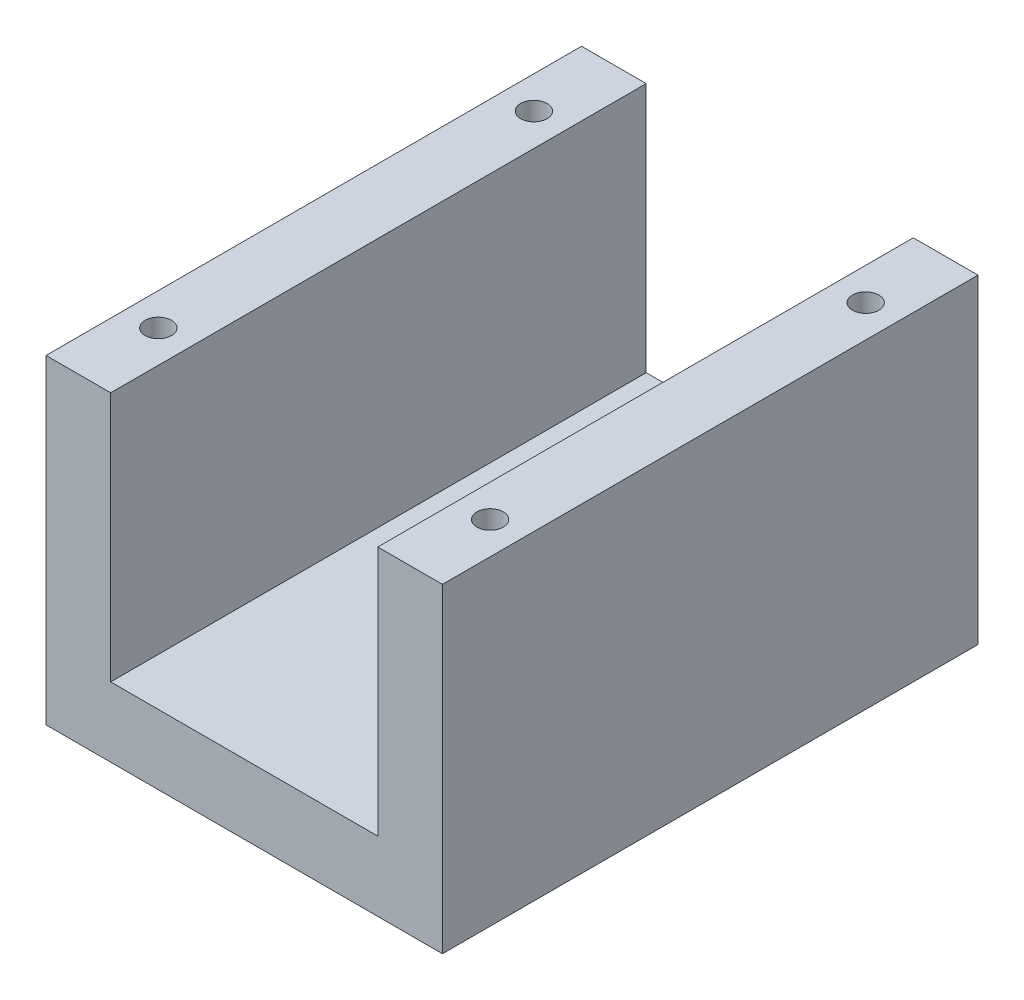
ISO-10303-21;
HEADER;
FILE_DESCRIPTION(('STEP AP214'),'2;1');
FILE_NAME('part.step','',(''),(''),'','','');
FILE_SCHEMA(('AUTOMOTIVE_DESIGN { 1 0 10303 214 1 1 1 1 }'));
ENDSEC;
DATA;
#1=APPLICATION_CONTEXT('core data for automotive mechanical design processes');
#2=APPLICATION_PROTOCOL_DEFINITION('international standard','automotive_design',2000,#1);
#3=PRODUCT_CONTEXT('',#1,'mechanical');
#4=PRODUCT('Part','Part','',(#3));
#5=PRODUCT_RELATED_PRODUCT_CATEGORY('part','',(#4));
#6=PRODUCT_DEFINITION_FORMATION('','',#4);
#7=PRODUCT_DEFINITION_CONTEXT('part definition',#1,'design');
#8=PRODUCT_DEFINITION('design','',#6,#7);
#9=PRODUCT_DEFINITION_SHAPE('','',#8);
#10=(LENGTH_UNIT() NAMED_UNIT(*) SI_UNIT(.MILLI.,.METRE.));
#11=(NAMED_UNIT(*) PLANE_ANGLE_UNIT() SI_UNIT($,.RADIAN.));
#12=(NAMED_UNIT(*) SI_UNIT($,.STERADIAN.) SOLID_ANGLE_UNIT());
#13=UNCERTAINTY_MEASURE_WITH_UNIT(LENGTH_MEASURE(1.E-05),#10,'distance_accuracy_value','');
#14=(GEOMETRIC_REPRESENTATION_CONTEXT(3) GLOBAL_UNCERTAINTY_ASSIGNED_CONTEXT((#13)) GLOBAL_UNIT_ASSIGNED_CONTEXT((#10,
#11,#12)) REPRESENTATION_CONTEXT('',''));
#15=CARTESIAN_POINT('',(0.,0.,0.));
#16=DIRECTION('',(0.,0.,1.));
#17=DIRECTION('',(1.,0.,0.));
#18=AXIS2_PLACEMENT_3D('',#15,#16,#17);
#19=CARTESIAN_POINT('',(28.5,44.,-18.5));
#20=DIRECTION('',(-1.,0.,0.));
#21=DIRECTION('',(0.,0.,1.));
#22=AXIS2_PLACEMENT_3D('',#19,#20,#21);
#23=PLANE('',#22);
#24=DIRECTION('',(0.,-1.,0.));
#25=VECTOR('',#24,1.);
#26=CARTESIAN_POINT('',(28.5,44.,-38.5));
#27=LINE('',#26,#25);
#28=CARTESIAN_POINT('',(28.5,36.,-38.5));
#29=VERTEX_POINT('',#28);
#30=CARTESIAN_POINT('',(28.5,-10.,-38.5));
#31=VERTEX_POINT('',#30);
#32=EDGE_CURVE('E126',#29,#31,#27,.T.);
#33=ORIENTED_EDGE('',*,*,#32,.F.);
#34=DIRECTION('',(0.,0.,1.));
#35=VECTOR('',#34,1.);
#36=CARTESIAN_POINT('',(28.5,36.,-18.5));
#37=LINE('',#36,#35);
#38=CARTESIAN_POINT('',(28.5,36.,38.5));
#39=VERTEX_POINT('',#38);
#40=EDGE_CURVE('E165',#29,#39,#37,.T.);
#41=ORIENTED_EDGE('',*,*,#40,.T.);
#42=DIRECTION('',(0.,1.,0.));
#43=VECTOR('',#42,1.);
#44=CARTESIAN_POINT('',(28.5,0.,38.5));
#45=LINE('',#44,#43);
#46=CARTESIAN_POINT('',(28.5,-10.,38.5));
#47=VERTEX_POINT('',#46);
#48=EDGE_CURVE('E153',#47,#39,#45,.T.);
#49=ORIENTED_EDGE('',*,*,#48,.F.);
#50=DIRECTION('',(0.,0.,1.));
#51=VECTOR('',#50,1.);
#52=CARTESIAN_POINT('',(28.5,-10.,38.5));
#53=LINE('',#52,#51);
#54=EDGE_CURVE('E190',#31,#47,#53,.T.);
#55=ORIENTED_EDGE('',*,*,#54,.F.);
#56=EDGE_LOOP('',(#33,#41,#49,#55));
#57=FACE_BOUND('',#56,.T.);
#58=ADVANCED_FACE('F36',(#57),#23,.F.);
#59=CARTESIAN_POINT('',(-28.5,44.,-18.5));
#60=DIRECTION('',(1.,0.,0.));
#61=DIRECTION('',(0.,0.,-1.));
#62=AXIS2_PLACEMENT_3D('',#59,#60,#61);
#63=PLANE('',#62);
#64=DIRECTION('',(0.,-1.,0.));
#65=VECTOR('',#64,1.);
#66=CARTESIAN_POINT('',(-28.5,44.,38.5));
#67=LINE('',#66,#65);
#68=CARTESIAN_POINT('',(-28.5,36.,38.5));
#69=VERTEX_POINT('',#68);
#70=CARTESIAN_POINT('',(-28.5,-10.,38.5));
#71=VERTEX_POINT('',#70);
#72=EDGE_CURVE('E106',#69,#71,#67,.T.);
#73=ORIENTED_EDGE('',*,*,#72,.F.);
#74=DIRECTION('',(0.,0.,1.));
#75=VECTOR('',#74,1.);
#76=CARTESIAN_POINT('',(-28.5,36.,15.5));
#77=LINE('',#76,#75);
#78=CARTESIAN_POINT('',(-28.5,36.,-38.5));
#79=VERTEX_POINT('',#78);
#80=EDGE_CURVE('E99',#79,#69,#77,.T.);
#81=ORIENTED_EDGE('',*,*,#80,.F.);
#82=DIRECTION('',(0.,1.,0.));
#83=VECTOR('',#82,1.);
#84=CARTESIAN_POINT('',(-28.5,0.,-38.5));
#85=LINE('',#84,#83);
#86=CARTESIAN_POINT('',(-28.5,-10.,-38.5));
#87=VERTEX_POINT('',#86);
#88=EDGE_CURVE('E104',#87,#79,#85,.T.);
#89=ORIENTED_EDGE('',*,*,#88,.F.);
#90=DIRECTION('',(0.,0.,-1.));
#91=VECTOR('',#90,1.);
#92=CARTESIAN_POINT('',(-28.5,-10.,-38.5));
#93=LINE('',#92,#91);
#94=EDGE_CURVE('E167',#71,#87,#93,.T.);
#95=ORIENTED_EDGE('',*,*,#94,.F.);
#96=EDGE_LOOP('',(#73,#81,#89,#95));
#97=FACE_BOUND('',#96,.T.);
#98=ADVANCED_FACE('F101',(#97),#63,.F.);
#99=CARTESIAN_POINT('',(-19.2,0.,-28.5));
#100=DIRECTION('',(-1.,0.,0.));
#101=DIRECTION('',(0.,0.,1.));
#102=AXIS2_PLACEMENT_3D('',#99,#100,#101);
#103=PLANE('',#102);
#104=DIRECTION('',(0.,0.,1.));
#105=VECTOR('',#104,1.);
#106=CARTESIAN_POINT('',(-19.2,36.,-28.5));
#107=LINE('',#106,#105);
#108=CARTESIAN_POINT('',(-19.2,36.,-38.5));
#109=VERTEX_POINT('',#108);
#110=CARTESIAN_POINT('',(-19.2,36.,38.5));
#111=VERTEX_POINT('',#110);
#112=EDGE_CURVE('E116',#109,#111,#107,.T.);
#113=ORIENTED_EDGE('',*,*,#112,.T.);
#114=DIRECTION('',(0.,1.,0.));
#115=VECTOR('',#114,1.);
#116=CARTESIAN_POINT('',(-19.2,0.,38.5));
#117=LINE('',#116,#115);
#118=CARTESIAN_POINT('',(-19.2,0.,38.5));
#119=VERTEX_POINT('',#118);
#120=EDGE_CURVE('E157',#119,#111,#117,.T.);
#121=ORIENTED_EDGE('',*,*,#120,.F.);
#122=DIRECTION('',(0.,0.,1.));
#123=VECTOR('',#122,1.);
#124=CARTESIAN_POINT('',(-19.2,0.,0.));
#125=LINE('',#124,#123);
#126=CARTESIAN_POINT('',(-19.2,0.,-38.5));
#127=VERTEX_POINT('',#126);
#128=EDGE_CURVE('E11',#127,#119,#125,.T.);
#129=ORIENTED_EDGE('',*,*,#128,.F.);
#130=DIRECTION('',(0.,-1.,0.));
#131=VECTOR('',#130,1.);
#132=CARTESIAN_POINT('',(-19.2,36.,-38.5));
#133=LINE('',#132,#131);
#134=EDGE_CURVE('E127',#109,#127,#133,.T.);
#135=ORIENTED_EDGE('',*,*,#134,.F.);
#136=EDGE_LOOP('',(#113,#121,#129,#135));
#137=FACE_BOUND('',#136,.T.);
#138=ADVANCED_FACE('F234',(#137),#103,.F.);
#139=CARTESIAN_POINT('',(19.2,36.,-28.5));
#140=DIRECTION('',(1.,0.,0.));
#141=DIRECTION('',(0.,1.,0.));
#142=AXIS2_PLACEMENT_3D('',#139,#140,#141);
#143=PLANE('',#142);
#144=DIRECTION('',(0.,0.,-1.));
#145=VECTOR('',#144,1.);
#146=CARTESIAN_POINT('',(19.2,0.,0.));
#147=LINE('',#146,#145);
#148=CARTESIAN_POINT('',(19.2,0.,38.5));
#149=VERTEX_POINT('',#148);
#150=CARTESIAN_POINT('',(19.2,0.,-38.5));
#151=VERTEX_POINT('',#150);
#152=EDGE_CURVE('E44',#149,#151,#147,.T.);
#153=ORIENTED_EDGE('',*,*,#152,.F.);
#154=DIRECTION('',(0.,-1.,0.));
#155=VECTOR('',#154,1.);
#156=CARTESIAN_POINT('',(19.2,36.,38.5));
#157=LINE('',#156,#155);
#158=CARTESIAN_POINT('',(19.2,36.,38.5));
#159=VERTEX_POINT('',#158);
#160=EDGE_CURVE('E151',#159,#149,#157,.T.);
#161=ORIENTED_EDGE('',*,*,#160,.F.);
#162=DIRECTION('',(0.,0.,1.));
#163=VECTOR('',#162,1.);
#164=CARTESIAN_POINT('',(19.2,36.,-28.5));
#165=LINE('',#164,#163);
#166=CARTESIAN_POINT('',(19.2,36.,-38.5));
#167=VERTEX_POINT('',#166);
#168=EDGE_CURVE('E129',#167,#159,#165,.T.);
#169=ORIENTED_EDGE('',*,*,#168,.F.);
#170=DIRECTION('',(0.,1.,0.));
#171=VECTOR('',#170,1.);
#172=CARTESIAN_POINT('',(19.2,0.,-38.5));
#173=LINE('',#172,#171);
#174=EDGE_CURVE('E131',#151,#167,#173,.T.);
#175=ORIENTED_EDGE('',*,*,#174,.F.);
#176=EDGE_LOOP('',(#153,#161,#169,#175));
#177=FACE_BOUND('',#176,.T.);
#178=ADVANCED_FACE('F156',(#177),#143,.F.);
#179=CARTESIAN_POINT('',(0.,0.,-38.5));
#180=DIRECTION('',(0.,0.,1.));
#181=DIRECTION('',(1.,0.,0.));
#182=AXIS2_PLACEMENT_3D('',#179,#180,#181);
#183=PLANE('',#182);
#184=ORIENTED_EDGE('',*,*,#88,.T.);
#185=DIRECTION('',(-1.,0.,0.));
#186=VECTOR('',#185,1.);
#187=CARTESIAN_POINT('',(71.5,36.,-38.5));
#188=LINE('',#187,#186);
#189=EDGE_CURVE('E113',#109,#79,#188,.T.);
#190=ORIENTED_EDGE('',*,*,#189,.F.);
#191=ORIENTED_EDGE('',*,*,#134,.T.);
#192=DIRECTION('',(1.,0.,0.));
#193=VECTOR('',#192,1.);
#194=CARTESIAN_POINT('',(28.5,0.,-38.5));
#195=LINE('',#194,#193);
#196=EDGE_CURVE('E163',#127,#151,#195,.T.);
#197=ORIENTED_EDGE('',*,*,#196,.T.);
#198=ORIENTED_EDGE('',*,*,#174,.T.);
#199=EDGE_CURVE('E120',#29,#167,#188,.T.);
#200=ORIENTED_EDGE('',*,*,#199,.F.);
#201=ORIENTED_EDGE('',*,*,#32,.T.);
#202=DIRECTION('',(1.,0.,0.));
#203=VECTOR('',#202,1.);
#204=CARTESIAN_POINT('',(28.5,-10.,-38.5));
#205=LINE('',#204,#203);
#206=EDGE_CURVE('E124',#87,#31,#205,.T.);
#207=ORIENTED_EDGE('',*,*,#206,.F.);
#208=EDGE_LOOP('',(#184,#190,#191,#197,#198,#200,#201,#207));
#209=FACE_BOUND('',#208,.T.);
#210=ADVANCED_FACE('F122',(#209),#183,.F.);
#211=CARTESIAN_POINT('',(0.,0.,38.5));
#212=DIRECTION('',(0.,0.,1.));
#213=DIRECTION('',(1.,0.,0.));
#214=AXIS2_PLACEMENT_3D('',#211,#212,#213);
#215=PLANE('',#214);
#216=DIRECTION('',(-1.,0.,0.));
#217=VECTOR('',#216,1.);
#218=CARTESIAN_POINT('',(71.5,36.,38.5));
#219=LINE('',#218,#217);
#220=EDGE_CURVE('E154',#111,#69,#219,.T.);
#221=ORIENTED_EDGE('',*,*,#220,.T.);
#222=ORIENTED_EDGE('',*,*,#72,.T.);
#223=DIRECTION('',(-1.,0.,0.));
#224=VECTOR('',#223,1.);
#225=CARTESIAN_POINT('',(-28.5,-10.,38.5));
#226=LINE('',#225,#224);
#227=EDGE_CURVE('E172',#47,#71,#226,.T.);
#228=ORIENTED_EDGE('',*,*,#227,.F.);
#229=ORIENTED_EDGE('',*,*,#48,.T.);
#230=EDGE_CURVE('E142',#39,#159,#219,.T.);
#231=ORIENTED_EDGE('',*,*,#230,.T.);
#232=ORIENTED_EDGE('',*,*,#160,.T.);
#233=DIRECTION('',(-1.,0.,0.));
#234=VECTOR('',#233,1.);
#235=CARTESIAN_POINT('',(-28.5,0.,38.5));
#236=LINE('',#235,#234);
#237=EDGE_CURVE('E51',#149,#119,#236,.T.);
#238=ORIENTED_EDGE('',*,*,#237,.T.);
#239=ORIENTED_EDGE('',*,*,#120,.T.);
#240=EDGE_LOOP('',(#221,#222,#228,#229,#231,#232,#238,#239));
#241=FACE_BOUND('',#240,.T.);
#242=ADVANCED_FACE('F150',(#241),#215,.T.);
#243=CARTESIAN_POINT('',(0.,36.,0.));
#244=DIRECTION('',(0.,-1.,0.));
#245=DIRECTION('',(0.,0.,-1.));
#246=AXIS2_PLACEMENT_3D('',#243,#244,#245);
#247=PLANE('',#246);
#248=ORIENTED_EDGE('',*,*,#220,.F.);
#249=ORIENTED_EDGE('',*,*,#112,.F.);
#250=ORIENTED_EDGE('',*,*,#189,.T.);
#251=ORIENTED_EDGE('',*,*,#80,.T.);
#252=EDGE_LOOP('',(#248,#249,#250,#251));
#253=FACE_BOUND('',#252,.T.);
#254=CARTESIAN_POINT('',(-23.85,36.,27.));
#255=DIRECTION('',(0.,-1.,0.));
#256=DIRECTION('',(0.,0.,-1.));
#257=AXIS2_PLACEMENT_3D('',#254,#255,#256);
#258=CIRCLE('',#257,1.9);
#259=CARTESIAN_POINT('',(-23.85,36.,25.1));
#260=VERTEX_POINT('',#259);
#261=EDGE_CURVE('E196',#260,#260,#258,.F.);
#262=ORIENTED_EDGE('',*,*,#261,.F.);
#263=EDGE_LOOP('',(#262));
#264=FACE_BOUND('',#263,.T.);
#265=CARTESIAN_POINT('',(-23.85,36.,-27.));
#266=DIRECTION('',(0.,-1.,0.));
#267=DIRECTION('',(0.,0.,-1.));
#268=AXIS2_PLACEMENT_3D('',#265,#266,#267);
#269=CIRCLE('',#268,1.9);
#270=CARTESIAN_POINT('',(-23.85,36.,-28.9));
#271=VERTEX_POINT('',#270);
#272=EDGE_CURVE('E199',#271,#271,#269,.F.);
#273=ORIENTED_EDGE('',*,*,#272,.F.);
#274=EDGE_LOOP('',(#273));
#275=FACE_BOUND('',#274,.T.);
#276=ADVANCED_FACE('F114',(#253,#264,#275),#247,.F.);
#277=ORIENTED_EDGE('',*,*,#168,.T.);
#278=ORIENTED_EDGE('',*,*,#230,.F.);
#279=ORIENTED_EDGE('',*,*,#40,.F.);
#280=ORIENTED_EDGE('',*,*,#199,.T.);
#281=EDGE_LOOP('',(#277,#278,#279,#280));
#282=FACE_BOUND('',#281,.T.);
#283=CARTESIAN_POINT('',(23.85,36.,-27.));
#284=DIRECTION('',(0.,-1.,0.));
#285=DIRECTION('',(0.,0.,-1.));
#286=AXIS2_PLACEMENT_3D('',#283,#284,#285);
#287=CIRCLE('',#286,1.9);
#288=CARTESIAN_POINT('',(23.85,36.,-28.9));
#289=VERTEX_POINT('',#288);
#290=EDGE_CURVE('E39',#289,#289,#287,.F.);
#291=ORIENTED_EDGE('',*,*,#290,.F.);
#292=EDGE_LOOP('',(#291));
#293=FACE_BOUND('',#292,.T.);
#294=CARTESIAN_POINT('',(23.85,36.,27.));
#295=DIRECTION('',(0.,-1.,0.));
#296=DIRECTION('',(0.,0.,-1.));
#297=AXIS2_PLACEMENT_3D('',#294,#295,#296);
#298=CIRCLE('',#297,1.9);
#299=CARTESIAN_POINT('',(23.85,36.,25.1));
#300=VERTEX_POINT('',#299);
#301=EDGE_CURVE('E169',#300,#300,#298,.F.);
#302=ORIENTED_EDGE('',*,*,#301,.F.);
#303=EDGE_LOOP('',(#302));
#304=FACE_BOUND('',#303,.T.);
#305=ADVANCED_FACE('F140',(#282,#293,#304),#247,.F.);
#306=CARTESIAN_POINT('',(0.,0.,0.));
#307=DIRECTION('',(0.,1.,0.));
#308=DIRECTION('',(0.,0.,1.));
#309=AXIS2_PLACEMENT_3D('',#306,#307,#308);
#310=PLANE('',#309);
#311=ORIENTED_EDGE('',*,*,#128,.T.);
#312=ORIENTED_EDGE('',*,*,#237,.F.);
#313=ORIENTED_EDGE('',*,*,#152,.T.);
#314=ORIENTED_EDGE('',*,*,#196,.F.);
#315=EDGE_LOOP('',(#311,#312,#313,#314));
#316=FACE_BOUND('',#315,.T.);
#317=ADVANCED_FACE('F210',(#316),#310,.T.);
#318=CARTESIAN_POINT('',(0.,-10.,0.));
#319=DIRECTION('',(0.,1.,0.));
#320=DIRECTION('',(0.,0.,1.));
#321=AXIS2_PLACEMENT_3D('',#318,#319,#320);
#322=PLANE('',#321);
#323=ORIENTED_EDGE('',*,*,#94,.T.);
#324=ORIENTED_EDGE('',*,*,#206,.T.);
#325=ORIENTED_EDGE('',*,*,#54,.T.);
#326=ORIENTED_EDGE('',*,*,#227,.T.);
#327=EDGE_LOOP('',(#323,#324,#325,#326));
#328=FACE_BOUND('',#327,.T.);
#329=ADVANCED_FACE('F188',(#328),#322,.F.);
#330=CARTESIAN_POINT('',(0.,4.,0.));
#331=DIRECTION('',(0.,1.,0.));
#332=DIRECTION('',(0.,0.,1.));
#333=AXIS2_PLACEMENT_3D('',#330,#331,#332);
#334=PLANE('',#333);
#335=CARTESIAN_POINT('',(23.85,4.,27.));
#336=DIRECTION('',(0.,1.,0.));
#337=DIRECTION('',(0.,0.,1.));
#338=AXIS2_PLACEMENT_3D('',#335,#336,#337);
#339=CIRCLE('',#338,1.9);
#340=CARTESIAN_POINT('',(23.85,4.,28.9));
#341=VERTEX_POINT('',#340);
#342=EDGE_CURVE('E110',#341,#341,#339,.T.);
#343=ORIENTED_EDGE('',*,*,#342,.T.);
#344=EDGE_LOOP('',(#343));
#345=FACE_BOUND('',#344,.T.);
#346=ADVANCED_FACE('F218',(#345),#334,.T.);
#347=CARTESIAN_POINT('',(23.85,4.,27.));
#348=DIRECTION('',(0.,1.,0.));
#349=DIRECTION('',(0.,0.,1.));
#350=AXIS2_PLACEMENT_3D('',#347,#348,#349);
#351=CYLINDRICAL_SURFACE('',#350,1.9);
#352=ORIENTED_EDGE('',*,*,#301,.T.);
#353=EDGE_LOOP('',(#352));
#354=FACE_BOUND('',#353,.T.);
#355=ORIENTED_EDGE('',*,*,#342,.F.);
#356=EDGE_LOOP('',(#355));
#357=FACE_BOUND('',#356,.T.);
#358=ADVANCED_FACE('F214',(#354,#357),#351,.F.);
#359=CARTESIAN_POINT('',(0.,4.,0.));
#360=DIRECTION('',(0.,1.,0.));
#361=DIRECTION('',(0.,0.,1.));
#362=AXIS2_PLACEMENT_3D('',#359,#360,#361);
#363=PLANE('',#362);
#364=CARTESIAN_POINT('',(23.85,4.,-27.));
#365=DIRECTION('',(0.,1.,0.));
#366=DIRECTION('',(0.,0.,1.));
#367=AXIS2_PLACEMENT_3D('',#364,#365,#366);
#368=CIRCLE('',#367,1.9);
#369=CARTESIAN_POINT('',(23.85,4.,-25.1));
#370=VERTEX_POINT('',#369);
#371=EDGE_CURVE('E181',#370,#370,#368,.T.);
#372=ORIENTED_EDGE('',*,*,#371,.T.);
#373=EDGE_LOOP('',(#372));
#374=FACE_BOUND('',#373,.T.);
#375=ADVANCED_FACE('F217',(#374),#363,.T.);
#376=CARTESIAN_POINT('',(23.85,4.,-27.));
#377=DIRECTION('',(0.,1.,0.));
#378=DIRECTION('',(0.,0.,1.));
#379=AXIS2_PLACEMENT_3D('',#376,#377,#378);
#380=CYLINDRICAL_SURFACE('',#379,1.9);
#381=ORIENTED_EDGE('',*,*,#290,.T.);
#382=EDGE_LOOP('',(#381));
#383=FACE_BOUND('',#382,.T.);
#384=ORIENTED_EDGE('',*,*,#371,.F.);
#385=EDGE_LOOP('',(#384));
#386=FACE_BOUND('',#385,.T.);
#387=ADVANCED_FACE('F206',(#383,#386),#380,.F.);
#388=CARTESIAN_POINT('',(0.,4.,0.));
#389=DIRECTION('',(0.,1.,0.));
#390=DIRECTION('',(0.,0.,1.));
#391=AXIS2_PLACEMENT_3D('',#388,#389,#390);
#392=PLANE('',#391);
#393=CARTESIAN_POINT('',(-23.85,4.,-27.));
#394=DIRECTION('',(0.,1.,0.));
#395=DIRECTION('',(0.,0.,1.));
#396=AXIS2_PLACEMENT_3D('',#393,#394,#395);
#397=CIRCLE('',#396,1.9);
#398=CARTESIAN_POINT('',(-23.85,4.,-25.1));
#399=VERTEX_POINT('',#398);
#400=EDGE_CURVE('E178',#399,#399,#397,.T.);
#401=ORIENTED_EDGE('',*,*,#400,.T.);
#402=EDGE_LOOP('',(#401));
#403=FACE_BOUND('',#402,.T.);
#404=ADVANCED_FACE('F330',(#403),#392,.T.);
#405=CARTESIAN_POINT('',(-23.85,4.,-27.));
#406=DIRECTION('',(0.,1.,0.));
#407=DIRECTION('',(0.,0.,1.));
#408=AXIS2_PLACEMENT_3D('',#405,#406,#407);
#409=CYLINDRICAL_SURFACE('',#408,1.9);
#410=ORIENTED_EDGE('',*,*,#272,.T.);
#411=EDGE_LOOP('',(#410));
#412=FACE_BOUND('',#411,.T.);
#413=ORIENTED_EDGE('',*,*,#400,.F.);
#414=EDGE_LOOP('',(#413));
#415=FACE_BOUND('',#414,.T.);
#416=ADVANCED_FACE('F338',(#412,#415),#409,.F.);
#417=CARTESIAN_POINT('',(0.,4.,0.));
#418=DIRECTION('',(0.,1.,0.));
#419=DIRECTION('',(0.,0.,1.));
#420=AXIS2_PLACEMENT_3D('',#417,#418,#419);
#421=PLANE('',#420);
#422=CARTESIAN_POINT('',(-23.85,4.,27.));
#423=DIRECTION('',(0.,1.,0.));
#424=DIRECTION('',(0.,0.,1.));
#425=AXIS2_PLACEMENT_3D('',#422,#423,#424);
#426=CIRCLE('',#425,1.9);
#427=CARTESIAN_POINT('',(-23.85,4.,28.9));
#428=VERTEX_POINT('',#427);
#429=EDGE_CURVE('E175',#428,#428,#426,.T.);
#430=ORIENTED_EDGE('',*,*,#429,.T.);
#431=EDGE_LOOP('',(#430));
#432=FACE_BOUND('',#431,.T.);
#433=ADVANCED_FACE('F348',(#432),#421,.T.);
#434=CARTESIAN_POINT('',(-23.85,4.,27.));
#435=DIRECTION('',(0.,1.,0.));
#436=DIRECTION('',(0.,0.,1.));
#437=AXIS2_PLACEMENT_3D('',#434,#435,#436);
#438=CYLINDRICAL_SURFACE('',#437,1.9);
#439=ORIENTED_EDGE('',*,*,#261,.T.);
#440=EDGE_LOOP('',(#439));
#441=FACE_BOUND('',#440,.T.);
#442=ORIENTED_EDGE('',*,*,#429,.F.);
#443=EDGE_LOOP('',(#442));
#444=FACE_BOUND('',#443,.T.);
#445=ADVANCED_FACE('F357',(#441,#444),#438,.F.);
#446=CLOSED_SHELL('',(#58,#98,#138,#178,#210,#242,#276,#305,#317,#329,#346,#358,#375,#387,#404,
#416,#433,#445));
#447=MANIFOLD_SOLID_BREP('B2',#446);
#448=ADVANCED_BREP_SHAPE_REPRESENTATION('',(#18,#447),#14);
#449=SHAPE_DEFINITION_REPRESENTATION(#9,#448);
ENDSEC;
END-ISO-10303-21;
